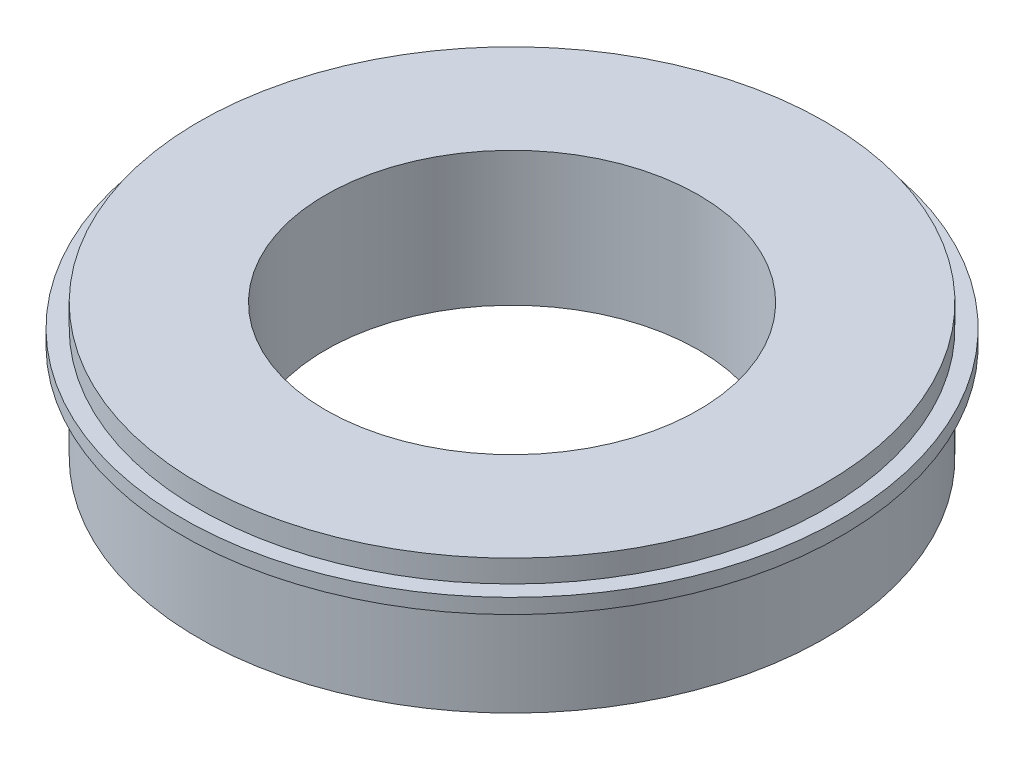
ISO-10303-21;
HEADER;
FILE_DESCRIPTION(('STEP AP214'),'2;1');
FILE_NAME('part.step','',(''),(''),'','','');
FILE_SCHEMA(('AUTOMOTIVE_DESIGN { 1 0 10303 214 1 1 1 1 }'));
ENDSEC;
DATA;
#1=APPLICATION_CONTEXT('core data for automotive mechanical design processes');
#2=APPLICATION_PROTOCOL_DEFINITION('international standard','automotive_design',2000,#1);
#3=PRODUCT_CONTEXT('',#1,'mechanical');
#4=PRODUCT('Part','Part','',(#3));
#5=PRODUCT_RELATED_PRODUCT_CATEGORY('part','',(#4));
#6=PRODUCT_DEFINITION_FORMATION('','',#4);
#7=PRODUCT_DEFINITION_CONTEXT('part definition',#1,'design');
#8=PRODUCT_DEFINITION('design','',#6,#7);
#9=PRODUCT_DEFINITION_SHAPE('','',#8);
#10=(LENGTH_UNIT() NAMED_UNIT(*) SI_UNIT(.MILLI.,.METRE.));
#11=(NAMED_UNIT(*) PLANE_ANGLE_UNIT() SI_UNIT($,.RADIAN.));
#12=(NAMED_UNIT(*) SI_UNIT($,.STERADIAN.) SOLID_ANGLE_UNIT());
#13=UNCERTAINTY_MEASURE_WITH_UNIT(LENGTH_MEASURE(1.E-05),#10,'distance_accuracy_value','');
#14=(GEOMETRIC_REPRESENTATION_CONTEXT(3) GLOBAL_UNCERTAINTY_ASSIGNED_CONTEXT((#13)) GLOBAL_UNIT_ASSIGNED_CONTEXT((#10,
#11,#12)) REPRESENTATION_CONTEXT('',''));
#15=CARTESIAN_POINT('',(0.,0.,0.));
#16=DIRECTION('',(0.,0.,1.));
#17=DIRECTION('',(1.,0.,0.));
#18=AXIS2_PLACEMENT_3D('',#15,#16,#17);
#19=CARTESIAN_POINT('',(0.,0.,0.));
#20=DIRECTION('',(0.,-1.,0.));
#21=DIRECTION('',(0.,0.,-1.));
#22=AXIS2_PLACEMENT_3D('',#19,#20,#21);
#23=CYLINDRICAL_SURFACE('',#22,12.5);
#24=CARTESIAN_POINT('',(0.,0.,0.));
#25=DIRECTION('',(0.,-1.,0.));
#26=DIRECTION('',(0.,0.,-1.));
#27=AXIS2_PLACEMENT_3D('',#24,#25,#26);
#28=CIRCLE('',#27,12.5);
#29=CARTESIAN_POINT('',(0.,0.,-12.5));
#30=VERTEX_POINT('',#29);
#31=EDGE_CURVE('E72',#30,#30,#28,.T.);
#32=ORIENTED_EDGE('',*,*,#31,.T.);
#33=EDGE_LOOP('',(#32));
#34=FACE_BOUND('',#33,.T.);
#35=CARTESIAN_POINT('',(0.,9.,0.));
#36=DIRECTION('',(0.,-1.,0.));
#37=DIRECTION('',(0.,0.,-1.));
#38=AXIS2_PLACEMENT_3D('',#35,#36,#37);
#39=CIRCLE('',#38,12.5);
#40=CARTESIAN_POINT('',(0.,9.,-12.5));
#41=VERTEX_POINT('',#40);
#42=EDGE_CURVE('E10',#41,#41,#39,.T.);
#43=ORIENTED_EDGE('',*,*,#42,.F.);
#44=EDGE_LOOP('',(#43));
#45=FACE_BOUND('',#44,.T.);
#46=ADVANCED_FACE('F37',(#34,#45),#23,.F.);
#47=CARTESIAN_POINT('',(12.5,9.,0.));
#48=DIRECTION('',(0.,1.,0.));
#49=DIRECTION('',(0.,0.,1.));
#50=AXIS2_PLACEMENT_3D('',#47,#48,#49);
#51=PLANE('',#50);
#52=ORIENTED_EDGE('',*,*,#42,.T.);
#53=EDGE_LOOP('',(#52));
#54=FACE_BOUND('',#53,.T.);
#55=CARTESIAN_POINT('',(0.,9.,0.));
#56=DIRECTION('',(0.,-1.,0.));
#57=DIRECTION('',(0.,0.,-1.));
#58=AXIS2_PLACEMENT_3D('',#55,#56,#57);
#59=CIRCLE('',#58,21.);
#60=CARTESIAN_POINT('',(0.,9.,-21.));
#61=VERTEX_POINT('',#60);
#62=EDGE_CURVE('E44',#61,#61,#59,.T.);
#63=ORIENTED_EDGE('',*,*,#62,.F.);
#64=EDGE_LOOP('',(#63));
#65=FACE_BOUND('',#64,.T.);
#66=ADVANCED_FACE('F91',(#54,#65),#51,.T.);
#67=CARTESIAN_POINT('',(0.,0.,0.));
#68=DIRECTION('',(0.,-1.,0.));
#69=DIRECTION('',(0.,0.,-1.));
#70=AXIS2_PLACEMENT_3D('',#67,#68,#69);
#71=CYLINDRICAL_SURFACE('',#70,21.);
#72=ORIENTED_EDGE('',*,*,#62,.T.);
#73=EDGE_LOOP('',(#72));
#74=FACE_BOUND('',#73,.T.);
#75=CARTESIAN_POINT('',(0.,7.5,0.));
#76=DIRECTION('',(0.,-1.,0.));
#77=DIRECTION('',(0.,0.,-1.));
#78=AXIS2_PLACEMENT_3D('',#75,#76,#77);
#79=CIRCLE('',#78,21.);
#80=CARTESIAN_POINT('',(0.,7.5,-21.));
#81=VERTEX_POINT('',#80);
#82=EDGE_CURVE('E49',#81,#81,#79,.T.);
#83=ORIENTED_EDGE('',*,*,#82,.F.);
#84=EDGE_LOOP('',(#83));
#85=FACE_BOUND('',#84,.T.);
#86=ADVANCED_FACE('F95',(#74,#85),#71,.T.);
#87=CARTESIAN_POINT('',(21.,7.5,0.));
#88=DIRECTION('',(0.,1.,0.));
#89=DIRECTION('',(0.,0.,1.));
#90=AXIS2_PLACEMENT_3D('',#87,#88,#89);
#91=PLANE('',#90);
#92=ORIENTED_EDGE('',*,*,#82,.T.);
#93=EDGE_LOOP('',(#92));
#94=FACE_BOUND('',#93,.T.);
#95=CARTESIAN_POINT('',(0.,7.5,0.));
#96=DIRECTION('',(0.,-1.,0.));
#97=DIRECTION('',(0.,0.,-1.));
#98=AXIS2_PLACEMENT_3D('',#95,#96,#97);
#99=CIRCLE('',#98,22.1);
#100=CARTESIAN_POINT('',(0.,7.5,-22.1));
#101=VERTEX_POINT('',#100);
#102=EDGE_CURVE('E54',#101,#101,#99,.T.);
#103=ORIENTED_EDGE('',*,*,#102,.F.);
#104=EDGE_LOOP('',(#103));
#105=FACE_BOUND('',#104,.T.);
#106=ADVANCED_FACE('F99',(#94,#105),#91,.T.);
#107=CARTESIAN_POINT('',(0.,0.,0.));
#108=DIRECTION('',(0.,-1.,0.));
#109=DIRECTION('',(0.,0.,-1.));
#110=AXIS2_PLACEMENT_3D('',#107,#108,#109);
#111=CYLINDRICAL_SURFACE('',#110,22.1);
#112=ORIENTED_EDGE('',*,*,#102,.T.);
#113=EDGE_LOOP('',(#112));
#114=FACE_BOUND('',#113,.T.);
#115=CARTESIAN_POINT('',(0.,6.5,0.));
#116=DIRECTION('',(0.,-1.,0.));
#117=DIRECTION('',(0.,0.,-1.));
#118=AXIS2_PLACEMENT_3D('',#115,#116,#117);
#119=CIRCLE('',#118,22.1);
#120=CARTESIAN_POINT('',(0.,6.5,-22.1));
#121=VERTEX_POINT('',#120);
#122=EDGE_CURVE('E60',#121,#121,#119,.T.);
#123=ORIENTED_EDGE('',*,*,#122,.F.);
#124=EDGE_LOOP('',(#123));
#125=FACE_BOUND('',#124,.T.);
#126=ADVANCED_FACE('F105',(#114,#125),#111,.T.);
#127=CARTESIAN_POINT('',(21.,6.5,0.));
#128=DIRECTION('',(0.,-1.,0.));
#129=DIRECTION('',(0.,0.,-1.));
#130=AXIS2_PLACEMENT_3D('',#127,#128,#129);
#131=PLANE('',#130);
#132=ORIENTED_EDGE('',*,*,#122,.T.);
#133=EDGE_LOOP('',(#132));
#134=FACE_BOUND('',#133,.T.);
#135=CARTESIAN_POINT('',(0.,6.5,0.));
#136=DIRECTION('',(0.,-1.,0.));
#137=DIRECTION('',(0.,0.,-1.));
#138=AXIS2_PLACEMENT_3D('',#135,#136,#137);
#139=CIRCLE('',#138,21.);
#140=CARTESIAN_POINT('',(0.,6.5,-21.));
#141=VERTEX_POINT('',#140);
#142=EDGE_CURVE('E64',#141,#141,#139,.T.);
#143=ORIENTED_EDGE('',*,*,#142,.F.);
#144=EDGE_LOOP('',(#143));
#145=FACE_BOUND('',#144,.T.);
#146=ADVANCED_FACE('F87',(#134,#145),#131,.T.);
#147=CARTESIAN_POINT('',(0.,0.,0.));
#148=DIRECTION('',(0.,-1.,0.));
#149=DIRECTION('',(0.,0.,-1.));
#150=AXIS2_PLACEMENT_3D('',#147,#148,#149);
#151=CYLINDRICAL_SURFACE('',#150,21.);
#152=ORIENTED_EDGE('',*,*,#142,.T.);
#153=EDGE_LOOP('',(#152));
#154=FACE_BOUND('',#153,.T.);
#155=CARTESIAN_POINT('',(0.,0.,0.));
#156=DIRECTION('',(0.,-1.,0.));
#157=DIRECTION('',(0.,0.,-1.));
#158=AXIS2_PLACEMENT_3D('',#155,#156,#157);
#159=CIRCLE('',#158,21.);
#160=CARTESIAN_POINT('',(0.,0.,-21.));
#161=VERTEX_POINT('',#160);
#162=EDGE_CURVE('E68',#161,#161,#159,.T.);
#163=ORIENTED_EDGE('',*,*,#162,.F.);
#164=EDGE_LOOP('',(#163));
#165=FACE_BOUND('',#164,.T.);
#166=ADVANCED_FACE('F81',(#154,#165),#151,.T.);
#167=CARTESIAN_POINT('',(12.5,0.,0.));
#168=DIRECTION('',(0.,-1.,0.));
#169=DIRECTION('',(0.,0.,-1.));
#170=AXIS2_PLACEMENT_3D('',#167,#168,#169);
#171=PLANE('',#170);
#172=ORIENTED_EDGE('',*,*,#162,.T.);
#173=EDGE_LOOP('',(#172));
#174=FACE_BOUND('',#173,.T.);
#175=ORIENTED_EDGE('',*,*,#31,.F.);
#176=EDGE_LOOP('',(#175));
#177=FACE_BOUND('',#176,.T.);
#178=ADVANCED_FACE('F79',(#174,#177),#171,.T.);
#179=CLOSED_SHELL('',(#46,#66,#86,#106,#126,#146,#166,#178));
#180=MANIFOLD_SOLID_BREP('B2',#179);
#181=ADVANCED_BREP_SHAPE_REPRESENTATION('',(#18,#180),#14);
#182=SHAPE_DEFINITION_REPRESENTATION(#9,#181);
ENDSEC;
END-ISO-10303-21;
